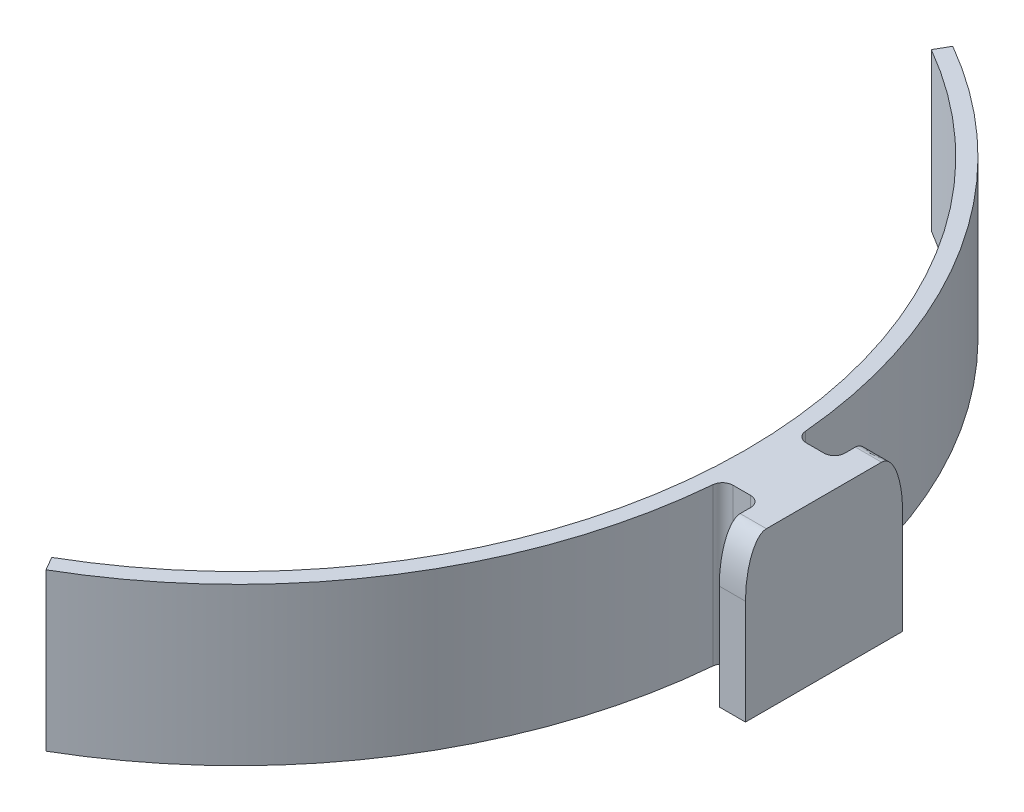
ISO-10303-21;
HEADER;
FILE_DESCRIPTION(('STEP AP214'),'2;1');
FILE_NAME('part.step','',(''),(''),'','','');
FILE_SCHEMA(('AUTOMOTIVE_DESIGN { 1 0 10303 214 1 1 1 1 }'));
ENDSEC;
DATA;
#1=APPLICATION_CONTEXT('core data for automotive mechanical design processes');
#2=APPLICATION_PROTOCOL_DEFINITION('international standard','automotive_design',2000,#1);
#3=PRODUCT_CONTEXT('',#1,'mechanical');
#4=PRODUCT('Part','Part','',(#3));
#5=PRODUCT_RELATED_PRODUCT_CATEGORY('part','',(#4));
#6=PRODUCT_DEFINITION_FORMATION('','',#4);
#7=PRODUCT_DEFINITION_CONTEXT('part definition',#1,'design');
#8=PRODUCT_DEFINITION('design','',#6,#7);
#9=PRODUCT_DEFINITION_SHAPE('','',#8);
#10=(LENGTH_UNIT() NAMED_UNIT(*) SI_UNIT(.MILLI.,.METRE.));
#11=(NAMED_UNIT(*) PLANE_ANGLE_UNIT() SI_UNIT($,.RADIAN.));
#12=(NAMED_UNIT(*) SI_UNIT($,.STERADIAN.) SOLID_ANGLE_UNIT());
#13=UNCERTAINTY_MEASURE_WITH_UNIT(LENGTH_MEASURE(1.E-05),#10,'distance_accuracy_value','');
#14=(GEOMETRIC_REPRESENTATION_CONTEXT(3) GLOBAL_UNCERTAINTY_ASSIGNED_CONTEXT((#13)) GLOBAL_UNIT_ASSIGNED_CONTEXT((#10,
#11,#12)) REPRESENTATION_CONTEXT('',''));
#15=CARTESIAN_POINT('',(0.,0.,0.));
#16=DIRECTION('',(0.,0.,1.));
#17=DIRECTION('',(1.,0.,0.));
#18=AXIS2_PLACEMENT_3D('',#15,#16,#17);
#19=CARTESIAN_POINT('',(48.5,9.99999999999999,3.50000000000009));
#20=DIRECTION('',(0.,0.,-1.));
#21=DIRECTION('',(-1.,0.,0.));
#22=AXIS2_PLACEMENT_3D('',#19,#20,#21);
#23=PLANE('',#22);
#24=DIRECTION('',(1.,0.,0.));
#25=VECTOR('',#24,1.);
#26=CARTESIAN_POINT('',(48.5,5.,3.50000000000009));
#27=LINE('',#26,#25);
#28=CARTESIAN_POINT('',(50.8010826656283,5.,3.50000000000009));
#29=VERTEX_POINT('',#28);
#30=CARTESIAN_POINT('',(52.5000000000003,5.,3.50000000000009));
#31=VERTEX_POINT('',#30);
#32=EDGE_CURVE('E341',#29,#31,#27,.T.);
#33=ORIENTED_EDGE('',*,*,#32,.F.);
#34=DIRECTION('',(0.,1.,0.));
#35=VECTOR('',#34,1.);
#36=CARTESIAN_POINT('',(50.8010826656283,9.99999999999999,3.50000000000009));
#37=LINE('',#36,#35);
#38=CARTESIAN_POINT('',(50.8010826656283,-10.,3.50000000000009));
#39=VERTEX_POINT('',#38);
#40=EDGE_CURVE('E348',#29,#39,#37,.F.);
#41=ORIENTED_EDGE('',*,*,#40,.T.);
#42=DIRECTION('',(1.,0.,0.));
#43=VECTOR('',#42,1.);
#44=CARTESIAN_POINT('',(48.5,-10.,3.50000000000009));
#45=LINE('',#44,#43);
#46=CARTESIAN_POINT('',(52.5000000000003,-10.,3.50000000000009));
#47=VERTEX_POINT('',#46);
#48=EDGE_CURVE('E338',#39,#47,#45,.T.);
#49=ORIENTED_EDGE('',*,*,#48,.T.);
#50=DIRECTION('',(0.,-1.,0.));
#51=VECTOR('',#50,1.);
#52=CARTESIAN_POINT('',(52.5000000000003,5.,3.50000000000009));
#53=LINE('',#52,#51);
#54=EDGE_CURVE('E497',#47,#31,#53,.F.);
#55=ORIENTED_EDGE('',*,*,#54,.T.);
#56=EDGE_LOOP('',(#33,#41,#49,#55));
#57=FACE_BOUND('',#56,.T.);
#58=ADVANCED_FACE('F47',(#57),#23,.F.);
#59=CARTESIAN_POINT('',(53.5000000000003,9.99999999999999,3.50000000000009));
#60=DIRECTION('',(1.,0.,0.));
#61=DIRECTION('',(0.,0.,-1.));
#62=AXIS2_PLACEMENT_3D('',#59,#60,#61);
#63=PLANE('',#62);
#64=DIRECTION('',(0.,0.,1.));
#65=VECTOR('',#64,1.);
#66=CARTESIAN_POINT('',(53.5000000000003,5.,3.50000000000009));
#67=LINE('',#66,#65);
#68=CARTESIAN_POINT('',(53.5000000000003,5.,4.50000000000009));
#69=VERTEX_POINT('',#68);
#70=CARTESIAN_POINT('',(53.5000000000003,5.,5.50000000000007));
#71=VERTEX_POINT('',#70);
#72=EDGE_CURVE('E343',#69,#71,#67,.T.);
#73=ORIENTED_EDGE('',*,*,#72,.F.);
#74=DIRECTION('',(0.,-1.,0.));
#75=VECTOR('',#74,1.);
#76=CARTESIAN_POINT('',(53.5000000000003,-10.,4.50000000000009));
#77=LINE('',#76,#75);
#78=CARTESIAN_POINT('',(53.5000000000003,-10.,4.50000000000009));
#79=VERTEX_POINT('',#78);
#80=EDGE_CURVE('E350',#69,#79,#77,.T.);
#81=ORIENTED_EDGE('',*,*,#80,.T.);
#82=DIRECTION('',(0.,0.,1.));
#83=VECTOR('',#82,1.);
#84=CARTESIAN_POINT('',(53.5000000000003,-10.,3.50000000000009));
#85=LINE('',#84,#83);
#86=CARTESIAN_POINT('',(53.5000000000003,-10.,7.50000000000006));
#87=VERTEX_POINT('',#86);
#88=EDGE_CURVE('E336',#79,#87,#85,.T.);
#89=ORIENTED_EDGE('',*,*,#88,.T.);
#90=DIRECTION('',(0.,-1.,0.));
#91=VECTOR('',#90,1.);
#92=CARTESIAN_POINT('',(53.5000000000003,9.99999999999999,7.50000000000006));
#93=LINE('',#92,#91);
#94=CARTESIAN_POINT('',(53.5000000000003,0.,7.50000000000006));
#95=VERTEX_POINT('',#94);
#96=EDGE_CURVE('E260',#95,#87,#93,.T.);
#97=ORIENTED_EDGE('',*,*,#96,.F.);
#98=CARTESIAN_POINT('',(53.5000000000002,5.,5.50000000000007));
#99=CARTESIAN_POINT('',(53.5000000000004,5.,7.50000000000007));
#100=CARTESIAN_POINT('',(53.5000000000004,0.,7.50000000000006));
#101=(BOUNDED_CURVE() B_SPLINE_CURVE(2,(#98,#99,#100),.UNSPECIFIED.,.F.,
.F.) B_SPLINE_CURVE_WITH_KNOTS((3,3),(0.,1.),
.UNSPECIFIED.) CURVE() GEOMETRIC_REPRESENTATION_ITEM() RATIONAL_B_SPLINE_CURVE((1.,
0.707106781186548,1.)) REPRESENTATION_ITEM(''));
#102=EDGE_CURVE('E403',#95,#71,#101,.F.);
#103=ORIENTED_EDGE('',*,*,#102,.T.);
#104=EDGE_LOOP('',(#73,#81,#89,#97,#103));
#105=FACE_BOUND('',#104,.T.);
#106=ADVANCED_FACE('F300',(#105),#63,.F.);
#107=CARTESIAN_POINT('',(53.5000000000003,9.99999999999999,7.50000000000006));
#108=DIRECTION('',(0.,0.,-1.));
#109=DIRECTION('',(-1.,0.,0.));
#110=AXIS2_PLACEMENT_3D('',#107,#108,#109);
#111=PLANE('',#110);
#112=DIRECTION('',(0.,-1.,0.));
#113=VECTOR('',#112,1.);
#114=CARTESIAN_POINT('',(56.0000000000004,9.99999999999999,7.49999999999986));
#115=LINE('',#114,#113);
#116=CARTESIAN_POINT('',(56.0000000000004,0.,7.49999999999986));
#117=VERTEX_POINT('',#116);
#118=CARTESIAN_POINT('',(56.0000000000004,-10.,7.49999999999986));
#119=VERTEX_POINT('',#118);
#120=EDGE_CURVE('E252',#117,#119,#115,.T.);
#121=ORIENTED_EDGE('',*,*,#120,.F.);
#122=CARTESIAN_POINT('',(53.3750000000003,0.,7.50000000000007));
#123=CARTESIAN_POINT('',(54.2916666666671,0.,7.5));
#124=CARTESIAN_POINT('',(55.2083333333337,0.,7.49999999999993));
#125=CARTESIAN_POINT('',(56.1250000000006,0.,7.49999999999986));
#126=(BOUNDED_CURVE() B_SPLINE_CURVE(3,(#122,#123,#124,#125),.UNSPECIFIED.,.F.,
.F.) B_SPLINE_CURVE_WITH_KNOTS((4,4),(-0.056124999999996,-0.0533749999999957),
.UNSPECIFIED.) CURVE() GEOMETRIC_REPRESENTATION_ITEM() RATIONAL_B_SPLINE_CURVE((1.,1.,1.,1.)) REPRESENTATION_ITEM(''));
#127=EDGE_CURVE('E282',#117,#95,#126,.F.);
#128=ORIENTED_EDGE('',*,*,#127,.T.);
#129=ORIENTED_EDGE('',*,*,#96,.T.);
#130=DIRECTION('',(1.,0.,0.));
#131=VECTOR('',#130,1.);
#132=CARTESIAN_POINT('',(53.5000000000003,-10.,7.50000000000006));
#133=LINE('',#132,#131);
#134=EDGE_CURVE('E333',#87,#119,#133,.T.);
#135=ORIENTED_EDGE('',*,*,#134,.T.);
#136=EDGE_LOOP('',(#121,#128,#129,#135));
#137=FACE_BOUND('',#136,.T.);
#138=ADVANCED_FACE('F290',(#137),#111,.F.);
#139=CARTESIAN_POINT('',(56.0000000000004,9.99999999999999,-7.50000000000011));
#140=DIRECTION('',(-1.,0.,0.));
#141=DIRECTION('',(0.,0.,1.));
#142=AXIS2_PLACEMENT_3D('',#139,#140,#141);
#143=PLANE('',#142);
#144=DIRECTION('',(0.,0.,-1.));
#145=VECTOR('',#144,1.);
#146=CARTESIAN_POINT('',(56.0000000000004,5.,-7.50000000000011));
#147=LINE('',#146,#145);
#148=CARTESIAN_POINT('',(56.0000000000004,5.,5.49999999999986));
#149=VERTEX_POINT('',#148);
#150=CARTESIAN_POINT('',(56.0000000000004,5.,-5.50000000000011));
#151=VERTEX_POINT('',#150);
#152=EDGE_CURVE('E220',#149,#151,#147,.T.);
#153=ORIENTED_EDGE('',*,*,#152,.F.);
#154=CARTESIAN_POINT('',(56.0000000000005,0.,7.49999999999987));
#155=CARTESIAN_POINT('',(56.0000000000005,5.,7.49999999999986));
#156=CARTESIAN_POINT('',(56.0000000000003,5.,5.49999999999986));
#157=(BOUNDED_CURVE() B_SPLINE_CURVE(2,(#154,#155,#156),.UNSPECIFIED.,.F.,
.F.) B_SPLINE_CURVE_WITH_KNOTS((3,3),(0.,1.),
.UNSPECIFIED.) CURVE() GEOMETRIC_REPRESENTATION_ITEM() RATIONAL_B_SPLINE_CURVE((1.,
0.707106781186548,1.)) REPRESENTATION_ITEM(''));
#158=EDGE_CURVE('E400',#149,#117,#157,.F.);
#159=ORIENTED_EDGE('',*,*,#158,.T.);
#160=ORIENTED_EDGE('',*,*,#120,.T.);
#161=DIRECTION('',(0.,0.,-1.));
#162=VECTOR('',#161,1.);
#163=CARTESIAN_POINT('',(56.0000000000004,-10.,-7.50000000000011));
#164=LINE('',#163,#162);
#165=CARTESIAN_POINT('',(56.0000000000004,-10.,-7.50000000000011));
#166=VERTEX_POINT('',#165);
#167=EDGE_CURVE('E330',#119,#166,#164,.T.);
#168=ORIENTED_EDGE('',*,*,#167,.T.);
#169=DIRECTION('',(0.,-1.,0.));
#170=VECTOR('',#169,1.);
#171=CARTESIAN_POINT('',(56.0000000000004,9.99999999999999,-7.50000000000011));
#172=LINE('',#171,#170);
#173=CARTESIAN_POINT('',(56.0000000000004,0.,-7.50000000000011));
#174=VERTEX_POINT('',#173);
#175=EDGE_CURVE('E261',#174,#166,#172,.T.);
#176=ORIENTED_EDGE('',*,*,#175,.F.);
#177=CARTESIAN_POINT('',(56.0000000000004,5.,-5.50000000000011));
#178=CARTESIAN_POINT('',(56.0000000000004,5.,-7.50000000000011));
#179=CARTESIAN_POINT('',(56.0000000000004,0.,-7.50000000000011));
#180=(BOUNDED_CURVE() B_SPLINE_CURVE(2,(#177,#178,#179),.UNSPECIFIED.,.F.,
.F.) B_SPLINE_CURVE_WITH_KNOTS((3,3),(0.,1.),
.UNSPECIFIED.) CURVE() GEOMETRIC_REPRESENTATION_ITEM() RATIONAL_B_SPLINE_CURVE((1.,
0.707106781186548,1.)) REPRESENTATION_ITEM(''));
#181=EDGE_CURVE('E476',#174,#151,#180,.F.);
#182=ORIENTED_EDGE('',*,*,#181,.T.);
#183=EDGE_LOOP('',(#153,#159,#160,#168,#176,#182));
#184=FACE_BOUND('',#183,.T.);
#185=ADVANCED_FACE('F299',(#184),#143,.F.);
#186=CARTESIAN_POINT('',(53.5000000000004,9.99999999999999,-7.50000000000012));
#187=DIRECTION('',(0.,0.,1.));
#188=DIRECTION('',(1.,0.,0.));
#189=AXIS2_PLACEMENT_3D('',#186,#187,#188);
#190=PLANE('',#189);
#191=DIRECTION('',(0.,-1.,0.));
#192=VECTOR('',#191,1.);
#193=CARTESIAN_POINT('',(53.5000000000004,9.99999999999999,-7.50000000000012));
#194=LINE('',#193,#192);
#195=CARTESIAN_POINT('',(53.5000000000004,0.,-7.50000000000012));
#196=VERTEX_POINT('',#195);
#197=CARTESIAN_POINT('',(53.5000000000004,-10.,-7.50000000000012));
#198=VERTEX_POINT('',#197);
#199=EDGE_CURVE('E311',#196,#198,#194,.T.);
#200=ORIENTED_EDGE('',*,*,#199,.F.);
#201=CARTESIAN_POINT('',(56.1250000000004,0.,-7.50000000000011));
#202=CARTESIAN_POINT('',(55.2083333333338,0.,-7.50000000000012));
#203=CARTESIAN_POINT('',(54.291666666667,0.,-7.50000000000012));
#204=CARTESIAN_POINT('',(53.3750000000004,0.,-7.50000000000012));
#205=(BOUNDED_CURVE() B_SPLINE_CURVE(3,(#201,#202,#203,#204),.UNSPECIFIED.,.F.,
.F.) B_SPLINE_CURVE_WITH_KNOTS((4,4),(0.0533750000000005,0.0561250000000005),
.UNSPECIFIED.) CURVE() GEOMETRIC_REPRESENTATION_ITEM() RATIONAL_B_SPLINE_CURVE((1.,1.,1.,1.)) REPRESENTATION_ITEM(''));
#206=EDGE_CURVE('E486',#196,#174,#205,.F.);
#207=ORIENTED_EDGE('',*,*,#206,.T.);
#208=ORIENTED_EDGE('',*,*,#175,.T.);
#209=DIRECTION('',(-1.,0.,0.));
#210=VECTOR('',#209,1.);
#211=CARTESIAN_POINT('',(53.5000000000004,-10.,-7.50000000000012));
#212=LINE('',#211,#210);
#213=EDGE_CURVE('E327',#166,#198,#212,.T.);
#214=ORIENTED_EDGE('',*,*,#213,.T.);
#215=EDGE_LOOP('',(#200,#207,#208,#214));
#216=FACE_BOUND('',#215,.T.);
#217=ADVANCED_FACE('F392',(#216),#190,.F.);
#218=CARTESIAN_POINT('',(53.5000000000004,9.99999999999999,-3.49999999999996));
#219=DIRECTION('',(1.,0.,0.));
#220=DIRECTION('',(0.,0.,-1.));
#221=AXIS2_PLACEMENT_3D('',#218,#219,#220);
#222=PLANE('',#221);
#223=DIRECTION('',(0.,0.,1.));
#224=VECTOR('',#223,1.);
#225=CARTESIAN_POINT('',(53.5000000000004,-10.,-3.49999999999996));
#226=LINE('',#225,#224);
#227=CARTESIAN_POINT('',(53.5000000000004,-10.,-4.49999999999995));
#228=VERTEX_POINT('',#227);
#229=EDGE_CURVE('E324',#198,#228,#226,.T.);
#230=ORIENTED_EDGE('',*,*,#229,.T.);
#231=DIRECTION('',(0.,-1.,0.));
#232=VECTOR('',#231,1.);
#233=CARTESIAN_POINT('',(53.5000000000004,5.,-4.49999999999995));
#234=LINE('',#233,#232);
#235=CARTESIAN_POINT('',(53.5000000000004,5.,-4.49999999999995));
#236=VERTEX_POINT('',#235);
#237=EDGE_CURVE('E359',#228,#236,#234,.F.);
#238=ORIENTED_EDGE('',*,*,#237,.T.);
#239=DIRECTION('',(0.,0.,1.));
#240=VECTOR('',#239,1.);
#241=CARTESIAN_POINT('',(53.5000000000004,5.,-3.49999999999996));
#242=LINE('',#241,#240);
#243=CARTESIAN_POINT('',(53.5000000000004,5.,-5.50000000000012));
#244=VERTEX_POINT('',#243);
#245=EDGE_CURVE('E198',#244,#236,#242,.T.);
#246=ORIENTED_EDGE('',*,*,#245,.F.);
#247=CARTESIAN_POINT('',(53.5000000000004,0.,-7.50000000000012));
#248=CARTESIAN_POINT('',(53.5000000000004,5.,-7.50000000000012));
#249=CARTESIAN_POINT('',(53.5000000000004,5.,-5.50000000000012));
#250=(BOUNDED_CURVE() B_SPLINE_CURVE(2,(#247,#248,#249),.UNSPECIFIED.,.F.,
.F.) B_SPLINE_CURVE_WITH_KNOTS((3,3),(0.,1.),
.UNSPECIFIED.) CURVE() GEOMETRIC_REPRESENTATION_ITEM() RATIONAL_B_SPLINE_CURVE((1.,
0.707106781186548,1.)) REPRESENTATION_ITEM(''));
#251=EDGE_CURVE('E389',#244,#196,#250,.F.);
#252=ORIENTED_EDGE('',*,*,#251,.T.);
#253=ORIENTED_EDGE('',*,*,#199,.T.);
#254=EDGE_LOOP('',(#230,#238,#246,#252,#253));
#255=FACE_BOUND('',#254,.T.);
#256=ADVANCED_FACE('F387',(#255),#222,.F.);
#257=CARTESIAN_POINT('',(48.5,9.99999999999999,-3.49999999999996));
#258=DIRECTION('',(0.,0.,1.));
#259=DIRECTION('',(1.,0.,0.));
#260=AXIS2_PLACEMENT_3D('',#257,#258,#259);
#261=PLANE('',#260);
#262=DIRECTION('',(-1.,0.,0.));
#263=VECTOR('',#262,1.);
#264=CARTESIAN_POINT('',(48.5,5.,-3.49999999999996));
#265=LINE('',#264,#263);
#266=CARTESIAN_POINT('',(52.5000000000004,5.,-3.49999999999996));
#267=VERTEX_POINT('',#266);
#268=CARTESIAN_POINT('',(50.8010826656283,5.,-3.49999999999996));
#269=VERTEX_POINT('',#268);
#270=EDGE_CURVE('E269',#267,#269,#265,.T.);
#271=ORIENTED_EDGE('',*,*,#270,.F.);
#272=DIRECTION('',(0.,-1.,0.));
#273=VECTOR('',#272,1.);
#274=CARTESIAN_POINT('',(52.5000000000004,-10.,-3.49999999999996));
#275=LINE('',#274,#273);
#276=CARTESIAN_POINT('',(52.5000000000004,-10.,-3.49999999999996));
#277=VERTEX_POINT('',#276);
#278=EDGE_CURVE('E356',#267,#277,#275,.T.);
#279=ORIENTED_EDGE('',*,*,#278,.T.);
#280=DIRECTION('',(-1.,0.,0.));
#281=VECTOR('',#280,1.);
#282=CARTESIAN_POINT('',(48.5,-10.,-3.49999999999996));
#283=LINE('',#282,#281);
#284=CARTESIAN_POINT('',(50.8010826656283,-10.,-3.49999999999996));
#285=VERTEX_POINT('',#284);
#286=EDGE_CURVE('E318',#277,#285,#283,.T.);
#287=ORIENTED_EDGE('',*,*,#286,.T.);
#288=DIRECTION('',(0.,1.,0.));
#289=VECTOR('',#288,1.);
#290=CARTESIAN_POINT('',(50.8010826656283,9.99999999999999,-3.49999999999996));
#291=LINE('',#290,#289);
#292=EDGE_CURVE('E353',#285,#269,#291,.T.);
#293=ORIENTED_EDGE('',*,*,#292,.T.);
#294=EDGE_LOOP('',(#271,#279,#287,#293));
#295=FACE_BOUND('',#294,.T.);
#296=ADVANCED_FACE('F246',(#295),#261,.F.);
#297=CARTESIAN_POINT('',(50.,-10.,0.));
#298=DIRECTION('',(0.,-1.,0.));
#299=DIRECTION('',(0.,0.,-1.));
#300=AXIS2_PLACEMENT_3D('',#297,#298,#299);
#301=PLANE('',#300);
#302=ORIENTED_EDGE('',*,*,#48,.F.);
#303=CARTESIAN_POINT('',(50.8010826656283,-10.,4.50000000000009));
#304=DIRECTION('',(0.,-1.,0.));
#305=DIRECTION('',(0.,0.,-1.));
#306=AXIS2_PLACEMENT_3D('',#303,#304,#305);
#307=CIRCLE('',#306,1.);
#308=CARTESIAN_POINT('',(49.8049830055179,-10.,4.41176470588244));
#309=VERTEX_POINT('',#308);
#310=EDGE_CURVE('E364',#39,#309,#307,.F.);
#311=ORIENTED_EDGE('',*,*,#310,.T.);
#312=CARTESIAN_POINT('',(0.,-10.,0.));
#313=DIRECTION('',(0.,-1.,0.));
#314=DIRECTION('',(0.,0.,-1.));
#315=AXIS2_PLACEMENT_3D('',#312,#313,#314);
#316=CIRCLE('',#315,50.);
#317=CARTESIAN_POINT('',(25.0000000000002,-10.,43.3012701892218));
#318=VERTEX_POINT('',#317);
#319=EDGE_CURVE('E195',#318,#309,#316,.F.);
#320=ORIENTED_EDGE('',*,*,#319,.F.);
#321=DIRECTION('',(0.500000000000004,0.,0.866025403784436));
#322=VECTOR('',#321,1.);
#323=CARTESIAN_POINT('',(25.0000000000002,-10.,43.3012701892218));
#324=LINE('',#323,#322);
#325=CARTESIAN_POINT('',(24.2500000000002,-10.,42.0022320835452));
#326=VERTEX_POINT('',#325);
#327=EDGE_CURVE('E200',#326,#318,#324,.T.);
#328=ORIENTED_EDGE('',*,*,#327,.F.);
#329=CARTESIAN_POINT('',(0.,-10.,0.));
#330=DIRECTION('',(0.,-1.,0.));
#331=DIRECTION('',(0.,0.,-1.));
#332=AXIS2_PLACEMENT_3D('',#329,#330,#331);
#333=CIRCLE('',#332,48.5);
#334=CARTESIAN_POINT('',(24.2500000000002,-10.,-42.0022320835452));
#335=VERTEX_POINT('',#334);
#336=EDGE_CURVE('E204',#335,#326,#333,.T.);
#337=ORIENTED_EDGE('',*,*,#336,.F.);
#338=DIRECTION('',(-0.500000000000008,0.,0.866025403784434));
#339=VECTOR('',#338,1.);
#340=CARTESIAN_POINT('',(25.0000000000002,-10.,-43.3012701892218));
#341=LINE('',#340,#339);
#342=CARTESIAN_POINT('',(25.0000000000002,-10.,-43.3012701892218));
#343=VERTEX_POINT('',#342);
#344=EDGE_CURVE('E183',#343,#335,#341,.T.);
#345=ORIENTED_EDGE('',*,*,#344,.F.);
#346=CARTESIAN_POINT('',(0.,-10.,0.));
#347=DIRECTION('',(0.,-1.,0.));
#348=DIRECTION('',(0.,0.,-1.));
#349=AXIS2_PLACEMENT_3D('',#346,#347,#348);
#350=CIRCLE('',#349,50.);
#351=CARTESIAN_POINT('',(49.8049830055179,-10.,-4.41176470588231));
#352=VERTEX_POINT('',#351);
#353=EDGE_CURVE('E179',#352,#343,#350,.F.);
#354=ORIENTED_EDGE('',*,*,#353,.F.);
#355=CARTESIAN_POINT('',(50.8010826656283,-10.,-4.49999999999996));
#356=DIRECTION('',(0.,-1.,0.));
#357=DIRECTION('',(0.,0.,-1.));
#358=AXIS2_PLACEMENT_3D('',#355,#356,#357);
#359=CIRCLE('',#358,1.);
#360=EDGE_CURVE('E12',#352,#285,#359,.F.);
#361=ORIENTED_EDGE('',*,*,#360,.T.);
#362=ORIENTED_EDGE('',*,*,#286,.F.);
#363=CARTESIAN_POINT('',(52.5000000000004,-10.,-4.49999999999996));
#364=DIRECTION('',(0.,-1.,0.));
#365=DIRECTION('',(0.,0.,-1.));
#366=AXIS2_PLACEMENT_3D('',#363,#364,#365);
#367=CIRCLE('',#366,1.);
#368=EDGE_CURVE('E370',#277,#228,#367,.F.);
#369=ORIENTED_EDGE('',*,*,#368,.T.);
#370=ORIENTED_EDGE('',*,*,#229,.F.);
#371=ORIENTED_EDGE('',*,*,#213,.F.);
#372=ORIENTED_EDGE('',*,*,#167,.F.);
#373=ORIENTED_EDGE('',*,*,#134,.F.);
#374=ORIENTED_EDGE('',*,*,#88,.F.);
#375=CARTESIAN_POINT('',(52.5000000000003,-10.,4.50000000000009));
#376=DIRECTION('',(0.,-1.,0.));
#377=DIRECTION('',(0.,0.,-1.));
#378=AXIS2_PLACEMENT_3D('',#375,#376,#377);
#379=CIRCLE('',#378,1.);
#380=EDGE_CURVE('E366',#79,#47,#379,.F.);
#381=ORIENTED_EDGE('',*,*,#380,.T.);
#382=EDGE_LOOP('',(#302,#311,#320,#328,#337,#345,#354,#361,#362,#369,#370,#371,#372,#373,#374,#381));
#383=FACE_BOUND('',#382,.T.);
#384=ADVANCED_FACE('F244',(#383),#301,.T.);
#385=CARTESIAN_POINT('',(0.,5.,-50.));
#386=DIRECTION('',(0.,1.,0.));
#387=DIRECTION('',(0.,0.,1.));
#388=AXIS2_PLACEMENT_3D('',#385,#386,#387);
#389=PLANE('',#388);
#390=ORIENTED_EDGE('',*,*,#245,.T.);
#391=CARTESIAN_POINT('',(52.5000000000004,5.,-4.49999999999996));
#392=DIRECTION('',(0.,1.,0.));
#393=DIRECTION('',(0.,0.,1.));
#394=AXIS2_PLACEMENT_3D('',#391,#392,#393);
#395=CIRCLE('',#394,1.);
#396=EDGE_CURVE('E372',#236,#267,#395,.F.);
#397=ORIENTED_EDGE('',*,*,#396,.T.);
#398=ORIENTED_EDGE('',*,*,#270,.T.);
#399=CARTESIAN_POINT('',(50.8010826656283,5.,-4.49999999999996));
#400=DIRECTION('',(0.,1.,0.));
#401=DIRECTION('',(0.,0.,1.));
#402=AXIS2_PLACEMENT_3D('',#399,#400,#401);
#403=CIRCLE('',#402,1.);
#404=CARTESIAN_POINT('',(49.8049830055179,5.,-4.41176470588231));
#405=VERTEX_POINT('',#404);
#406=EDGE_CURVE('E55',#269,#405,#403,.F.);
#407=ORIENTED_EDGE('',*,*,#406,.T.);
#408=CARTESIAN_POINT('',(0.,5.,0.));
#409=DIRECTION('',(0.,1.,0.));
#410=DIRECTION('',(0.,0.,1.));
#411=AXIS2_PLACEMENT_3D('',#408,#409,#410);
#412=CIRCLE('',#411,50.);
#413=CARTESIAN_POINT('',(25.0000000000002,5.,-43.3012701892218));
#414=VERTEX_POINT('',#413);
#415=EDGE_CURVE('E168',#405,#414,#412,.T.);
#416=ORIENTED_EDGE('',*,*,#415,.T.);
#417=DIRECTION('',(-0.500000000000008,0.,0.866025403784434));
#418=VECTOR('',#417,1.);
#419=CARTESIAN_POINT('',(25.0000000000002,5.,-43.3012701892218));
#420=LINE('',#419,#418);
#421=CARTESIAN_POINT('',(24.2500000000002,5.,-42.0022320835452));
#422=VERTEX_POINT('',#421);
#423=EDGE_CURVE('E174',#414,#422,#420,.T.);
#424=ORIENTED_EDGE('',*,*,#423,.T.);
#425=CARTESIAN_POINT('',(0.,5.,0.));
#426=DIRECTION('',(0.,1.,0.));
#427=DIRECTION('',(0.,0.,1.));
#428=AXIS2_PLACEMENT_3D('',#425,#426,#427);
#429=CIRCLE('',#428,48.5);
#430=CARTESIAN_POINT('',(24.2500000000002,5.,42.0022320835452));
#431=VERTEX_POINT('',#430);
#432=EDGE_CURVE('E189',#422,#431,#429,.F.);
#433=ORIENTED_EDGE('',*,*,#432,.T.);
#434=DIRECTION('',(0.500000000000004,0.,0.866025403784436));
#435=VECTOR('',#434,1.);
#436=CARTESIAN_POINT('',(25.0000000000002,5.,43.3012701892218));
#437=LINE('',#436,#435);
#438=CARTESIAN_POINT('',(25.0000000000002,5.,43.3012701892218));
#439=VERTEX_POINT('',#438);
#440=EDGE_CURVE('E191',#431,#439,#437,.T.);
#441=ORIENTED_EDGE('',*,*,#440,.T.);
#442=CARTESIAN_POINT('',(0.,5.,0.));
#443=DIRECTION('',(0.,1.,0.));
#444=DIRECTION('',(0.,0.,1.));
#445=AXIS2_PLACEMENT_3D('',#442,#443,#444);
#446=CIRCLE('',#445,50.);
#447=CARTESIAN_POINT('',(49.8049830055179,5.,4.41176470588244));
#448=VERTEX_POINT('',#447);
#449=EDGE_CURVE('E209',#439,#448,#446,.T.);
#450=ORIENTED_EDGE('',*,*,#449,.T.);
#451=CARTESIAN_POINT('',(50.8010826656283,5.,4.50000000000009));
#452=DIRECTION('',(0.,1.,0.));
#453=DIRECTION('',(0.,0.,1.));
#454=AXIS2_PLACEMENT_3D('',#451,#452,#453);
#455=CIRCLE('',#454,1.);
#456=EDGE_CURVE('E362',#448,#29,#455,.F.);
#457=ORIENTED_EDGE('',*,*,#456,.T.);
#458=ORIENTED_EDGE('',*,*,#32,.T.);
#459=CARTESIAN_POINT('',(52.5000000000003,5.,4.50000000000009));
#460=DIRECTION('',(0.,1.,0.));
#461=DIRECTION('',(0.,0.,1.));
#462=AXIS2_PLACEMENT_3D('',#459,#460,#461);
#463=CIRCLE('',#462,1.);
#464=EDGE_CURVE('E368',#31,#69,#463,.F.);
#465=ORIENTED_EDGE('',*,*,#464,.T.);
#466=ORIENTED_EDGE('',*,*,#72,.T.);
#467=CARTESIAN_POINT('',(56.1250000000004,5.,5.49999999999986));
#468=CARTESIAN_POINT('',(55.2083333333337,5.,5.49999999999986));
#469=CARTESIAN_POINT('',(54.2916666666669,5.,5.50000000000007));
#470=CARTESIAN_POINT('',(53.3750000000001,5.,5.50000000000007));
#471=(BOUNDED_CURVE() B_SPLINE_CURVE(3,(#467,#468,#469,#470),.UNSPECIFIED.,.F.,
.F.) B_SPLINE_CURVE_WITH_KNOTS((4,4),(-0.056124999999996,-0.0533749999999957),
.UNSPECIFIED.) CURVE() GEOMETRIC_REPRESENTATION_ITEM() RATIONAL_B_SPLINE_CURVE((1.,1.,1.,1.)) REPRESENTATION_ITEM(''));
#472=EDGE_CURVE('E408',#71,#149,#471,.F.);
#473=ORIENTED_EDGE('',*,*,#472,.T.);
#474=ORIENTED_EDGE('',*,*,#152,.T.);
#475=CARTESIAN_POINT('',(53.3750000000004,5.,-5.50000000000012));
#476=CARTESIAN_POINT('',(54.2916666666671,5.,-5.50000000000012));
#477=CARTESIAN_POINT('',(55.2083333333338,5.,-5.50000000000011));
#478=CARTESIAN_POINT('',(56.1250000000004,5.,-5.50000000000011));
#479=(BOUNDED_CURVE() B_SPLINE_CURVE(3,(#475,#476,#477,#478),.UNSPECIFIED.,.F.,
.F.) B_SPLINE_CURVE_WITH_KNOTS((4,4),(0.0533750000000005,0.0561250000000005),
.UNSPECIFIED.) CURVE() GEOMETRIC_REPRESENTATION_ITEM() RATIONAL_B_SPLINE_CURVE((1.,1.,1.,1.)) REPRESENTATION_ITEM(''));
#480=EDGE_CURVE('E226',#151,#244,#479,.F.);
#481=ORIENTED_EDGE('',*,*,#480,.T.);
#482=EDGE_LOOP('',(#390,#397,#398,#407,#416,#424,#433,#441,#450,#457,#458,#465,#466,#473,#474,#481));
#483=FACE_BOUND('',#482,.T.);
#484=ADVANCED_FACE('F171',(#483),#389,.T.);
#485=CARTESIAN_POINT('',(56.1250000000006,0.,7.49999999999986));
#486=CARTESIAN_POINT('',(55.2083333333337,0.,7.49999999999993));
#487=CARTESIAN_POINT('',(54.2916666666671,0.,7.5));
#488=CARTESIAN_POINT('',(53.3750000000003,0.,7.50000000000007));
#489=CARTESIAN_POINT('',(56.1250000000006,5.,7.49999999999986));
#490=CARTESIAN_POINT('',(55.2083333333338,5.,7.49999999999986));
#491=CARTESIAN_POINT('',(54.2916666666671,5.,7.50000000000007));
#492=CARTESIAN_POINT('',(53.3750000000003,5.,7.50000000000007));
#493=CARTESIAN_POINT('',(56.1250000000004,5.,5.49999999999986));
#494=CARTESIAN_POINT('',(55.2083333333337,5.,5.49999999999986));
#495=CARTESIAN_POINT('',(54.2916666666669,5.,5.50000000000007));
#496=CARTESIAN_POINT('',(53.3750000000001,5.,5.50000000000007));
#497=(BOUNDED_SURFACE() B_SPLINE_SURFACE(2,3,((#485,#486,#487,#488),(#489,#490,#491,#492),(#493,
#494,#495,#496)),.UNSPECIFIED.,.F.,.F.,.F.) B_SPLINE_SURFACE_WITH_KNOTS((3,3),(4,4),(0.,1.),
(-0.056124999999996,-0.0533749999999957),
.UNSPECIFIED.) GEOMETRIC_REPRESENTATION_ITEM() RATIONAL_B_SPLINE_SURFACE(((1.,1.,1.,1.),
(0.707106781186548,0.707106781186548,0.707106781186548,0.707106781186548),(1.,1.,1.,1.))) REPRESENTATION_ITEM('') SURFACE());
#498=ORIENTED_EDGE('',*,*,#102,.F.);
#499=ORIENTED_EDGE('',*,*,#127,.F.);
#500=ORIENTED_EDGE('',*,*,#158,.F.);
#501=ORIENTED_EDGE('',*,*,#472,.F.);
#502=EDGE_LOOP('',(#498,#499,#500,#501));
#503=FACE_BOUND('',#502,.T.);
#504=ADVANCED_FACE('F243',(#503),#497,.T.);
#505=CARTESIAN_POINT('',(53.3750000000004,0.,-7.50000000000012));
#506=CARTESIAN_POINT('',(54.291666666667,0.,-7.50000000000012));
#507=CARTESIAN_POINT('',(55.2083333333338,0.,-7.50000000000012));
#508=CARTESIAN_POINT('',(56.1250000000004,0.,-7.50000000000011));
#509=CARTESIAN_POINT('',(53.3750000000004,5.,-7.50000000000012));
#510=CARTESIAN_POINT('',(54.2916666666671,5.,-7.50000000000012));
#511=CARTESIAN_POINT('',(55.2083333333338,5.,-7.50000000000011));
#512=CARTESIAN_POINT('',(56.1250000000004,5.,-7.50000000000011));
#513=CARTESIAN_POINT('',(53.3750000000004,5.,-5.50000000000012));
#514=CARTESIAN_POINT('',(54.2916666666671,5.,-5.50000000000012));
#515=CARTESIAN_POINT('',(55.2083333333338,5.,-5.50000000000011));
#516=CARTESIAN_POINT('',(56.1250000000004,5.,-5.50000000000011));
#517=(BOUNDED_SURFACE() B_SPLINE_SURFACE(2,3,((#505,#506,#507,#508),(#509,#510,#511,#512),(#513,
#514,#515,#516)),.UNSPECIFIED.,.F.,.F.,.F.) B_SPLINE_SURFACE_WITH_KNOTS((3,3),(4,4),(0.,1.),
(0.0533750000000005,0.0561250000000005),
.UNSPECIFIED.) GEOMETRIC_REPRESENTATION_ITEM() RATIONAL_B_SPLINE_SURFACE(((1.,1.,1.,1.),
(0.707106781186548,0.707106781186548,0.707106781186548,0.707106781186548),(1.,1.,1.,1.))) REPRESENTATION_ITEM('') SURFACE());
#518=ORIENTED_EDGE('',*,*,#181,.F.);
#519=ORIENTED_EDGE('',*,*,#206,.F.);
#520=ORIENTED_EDGE('',*,*,#251,.F.);
#521=ORIENTED_EDGE('',*,*,#480,.F.);
#522=EDGE_LOOP('',(#518,#519,#520,#521));
#523=FACE_BOUND('',#522,.T.);
#524=ADVANCED_FACE('F431',(#523),#517,.T.);
#525=CARTESIAN_POINT('',(0.,-100.998004926201,0.));
#526=DIRECTION('',(0.,1.,0.));
#527=DIRECTION('',(0.,0.,1.));
#528=AXIS2_PLACEMENT_3D('',#525,#526,#527);
#529=CYLINDRICAL_SURFACE('',#528,50.);
#530=ORIENTED_EDGE('',*,*,#415,.F.);
#531=DIRECTION('',(0.,1.,0.));
#532=VECTOR('',#531,1.);
#533=CARTESIAN_POINT('',(49.8049830055179,-100.998004926201,-4.41176470588231));
#534=LINE('',#533,#532);
#535=EDGE_CURVE('E68',#405,#352,#534,.F.);
#536=ORIENTED_EDGE('',*,*,#535,.T.);
#537=ORIENTED_EDGE('',*,*,#353,.T.);
#538=DIRECTION('',(0.,1.,0.));
#539=VECTOR('',#538,1.);
#540=CARTESIAN_POINT('',(25.0000000000002,-100.998004926201,-43.3012701892218));
#541=LINE('',#540,#539);
#542=EDGE_CURVE('E177',#343,#414,#541,.T.);
#543=ORIENTED_EDGE('',*,*,#542,.T.);
#544=EDGE_LOOP('',(#530,#536,#537,#543));
#545=FACE_BOUND('',#544,.T.);
#546=ADVANCED_FACE('F178',(#545),#529,.T.);
#547=CARTESIAN_POINT('',(25.0000000000002,-100.998004926201,-43.3012701892218));
#548=DIRECTION('',(-0.866025403784434,0.,-0.500000000000008));
#549=DIRECTION('',(-0.500000000000008,0.,0.866025403784434));
#550=AXIS2_PLACEMENT_3D('',#547,#548,#549);
#551=PLANE('',#550);
#552=ORIENTED_EDGE('',*,*,#542,.F.);
#553=ORIENTED_EDGE('',*,*,#344,.T.);
#554=DIRECTION('',(0.,1.,0.));
#555=VECTOR('',#554,1.);
#556=CARTESIAN_POINT('',(24.2500000000002,-100.998004926201,-42.0022320835452));
#557=LINE('',#556,#555);
#558=EDGE_CURVE('E187',#335,#422,#557,.T.);
#559=ORIENTED_EDGE('',*,*,#558,.T.);
#560=ORIENTED_EDGE('',*,*,#423,.F.);
#561=EDGE_LOOP('',(#552,#553,#559,#560));
#562=FACE_BOUND('',#561,.T.);
#563=ADVANCED_FACE('F185',(#562),#551,.T.);
#564=CARTESIAN_POINT('',(0.,-100.998004926201,0.));
#565=DIRECTION('',(0.,1.,0.));
#566=DIRECTION('',(0.,0.,1.));
#567=AXIS2_PLACEMENT_3D('',#564,#565,#566);
#568=CYLINDRICAL_SURFACE('',#567,48.5);
#569=ORIENTED_EDGE('',*,*,#558,.F.);
#570=ORIENTED_EDGE('',*,*,#336,.T.);
#571=DIRECTION('',(0.,1.,0.));
#572=VECTOR('',#571,1.);
#573=CARTESIAN_POINT('',(24.2500000000002,-100.998004926201,42.0022320835452));
#574=LINE('',#573,#572);
#575=EDGE_CURVE('E203',#326,#431,#574,.T.);
#576=ORIENTED_EDGE('',*,*,#575,.T.);
#577=ORIENTED_EDGE('',*,*,#432,.F.);
#578=EDGE_LOOP('',(#569,#570,#576,#577));
#579=FACE_BOUND('',#578,.T.);
#580=ADVANCED_FACE('F518',(#579),#568,.F.);
#581=CARTESIAN_POINT('',(25.0000000000002,-100.998004926201,43.3012701892218));
#582=DIRECTION('',(-0.866025403784436,0.,0.500000000000004));
#583=DIRECTION('',(0.500000000000004,0.,0.866025403784436));
#584=AXIS2_PLACEMENT_3D('',#581,#582,#583);
#585=PLANE('',#584);
#586=ORIENTED_EDGE('',*,*,#575,.F.);
#587=ORIENTED_EDGE('',*,*,#327,.T.);
#588=DIRECTION('',(0.,1.,0.));
#589=VECTOR('',#588,1.);
#590=CARTESIAN_POINT('',(25.0000000000002,-100.998004926201,43.3012701892218));
#591=LINE('',#590,#589);
#592=EDGE_CURVE('E199',#318,#439,#591,.T.);
#593=ORIENTED_EDGE('',*,*,#592,.T.);
#594=ORIENTED_EDGE('',*,*,#440,.F.);
#595=EDGE_LOOP('',(#586,#587,#593,#594));
#596=FACE_BOUND('',#595,.T.);
#597=ADVANCED_FACE('F516',(#596),#585,.T.);
#598=CARTESIAN_POINT('',(0.,-100.998004926201,0.));
#599=DIRECTION('',(0.,1.,0.));
#600=DIRECTION('',(0.,0.,1.));
#601=AXIS2_PLACEMENT_3D('',#598,#599,#600);
#602=CYLINDRICAL_SURFACE('',#601,50.);
#603=ORIENTED_EDGE('',*,*,#319,.T.);
#604=DIRECTION('',(0.,1.,0.));
#605=VECTOR('',#604,1.);
#606=CARTESIAN_POINT('',(49.8049830055179,-100.998004926201,4.41176470588244));
#607=LINE('',#606,#605);
#608=EDGE_CURVE('E490',#309,#448,#607,.T.);
#609=ORIENTED_EDGE('',*,*,#608,.T.);
#610=ORIENTED_EDGE('',*,*,#449,.F.);
#611=ORIENTED_EDGE('',*,*,#592,.F.);
#612=EDGE_LOOP('',(#603,#609,#610,#611));
#613=FACE_BOUND('',#612,.T.);
#614=ADVANCED_FACE('F509',(#613),#602,.T.);
#615=CARTESIAN_POINT('',(50.8010826656283,-100.998004926201,4.50000000000009));
#616=DIRECTION('',(0.,1.,0.));
#617=DIRECTION('',(0.,0.,1.));
#618=AXIS2_PLACEMENT_3D('',#615,#616,#617);
#619=CYLINDRICAL_SURFACE('',#618,1.);
#620=ORIENTED_EDGE('',*,*,#310,.F.);
#621=ORIENTED_EDGE('',*,*,#40,.F.);
#622=ORIENTED_EDGE('',*,*,#456,.F.);
#623=ORIENTED_EDGE('',*,*,#608,.F.);
#624=EDGE_LOOP('',(#620,#621,#622,#623));
#625=FACE_BOUND('',#624,.T.);
#626=ADVANCED_FACE('F505',(#625),#619,.F.);
#627=CARTESIAN_POINT('',(52.5000000000003,9.99999999999999,4.50000000000009));
#628=DIRECTION('',(0.,1.,0.));
#629=DIRECTION('',(0.,0.,1.));
#630=AXIS2_PLACEMENT_3D('',#627,#628,#629);
#631=CYLINDRICAL_SURFACE('',#630,1.);
#632=ORIENTED_EDGE('',*,*,#464,.F.);
#633=ORIENTED_EDGE('',*,*,#54,.F.);
#634=ORIENTED_EDGE('',*,*,#380,.F.);
#635=ORIENTED_EDGE('',*,*,#80,.F.);
#636=EDGE_LOOP('',(#632,#633,#634,#635));
#637=FACE_BOUND('',#636,.T.);
#638=ADVANCED_FACE('F583',(#637),#631,.F.);
#639=CARTESIAN_POINT('',(52.5000000000004,9.99999999999999,-4.49999999999996));
#640=DIRECTION('',(0.,1.,0.));
#641=DIRECTION('',(0.,0.,1.));
#642=AXIS2_PLACEMENT_3D('',#639,#640,#641);
#643=CYLINDRICAL_SURFACE('',#642,1.);
#644=ORIENTED_EDGE('',*,*,#396,.F.);
#645=ORIENTED_EDGE('',*,*,#237,.F.);
#646=ORIENTED_EDGE('',*,*,#368,.F.);
#647=ORIENTED_EDGE('',*,*,#278,.F.);
#648=EDGE_LOOP('',(#644,#645,#646,#647));
#649=FACE_BOUND('',#648,.T.);
#650=ADVANCED_FACE('F381',(#649),#643,.F.);
#651=CARTESIAN_POINT('',(50.8010826656283,-100.998004926201,-4.49999999999996));
#652=DIRECTION('',(0.,1.,0.));
#653=DIRECTION('',(0.,0.,1.));
#654=AXIS2_PLACEMENT_3D('',#651,#652,#653);
#655=CYLINDRICAL_SURFACE('',#654,1.);
#656=ORIENTED_EDGE('',*,*,#360,.F.);
#657=ORIENTED_EDGE('',*,*,#535,.F.);
#658=ORIENTED_EDGE('',*,*,#406,.F.);
#659=ORIENTED_EDGE('',*,*,#292,.F.);
#660=EDGE_LOOP('',(#656,#657,#658,#659));
#661=FACE_BOUND('',#660,.T.);
#662=ADVANCED_FACE('F49',(#661),#655,.F.);
#663=CLOSED_SHELL('',(#58,#106,#138,#185,#217,#256,#296,#384,#484,#504,#524,#546,#563,#580,#597,
#614,#626,#638,#650,#662));
#664=MANIFOLD_SOLID_BREP('B2',#663);
#665=ADVANCED_BREP_SHAPE_REPRESENTATION('',(#18,#664),#14);
#666=SHAPE_DEFINITION_REPRESENTATION(#9,#665);
ENDSEC;
END-ISO-10303-21;
